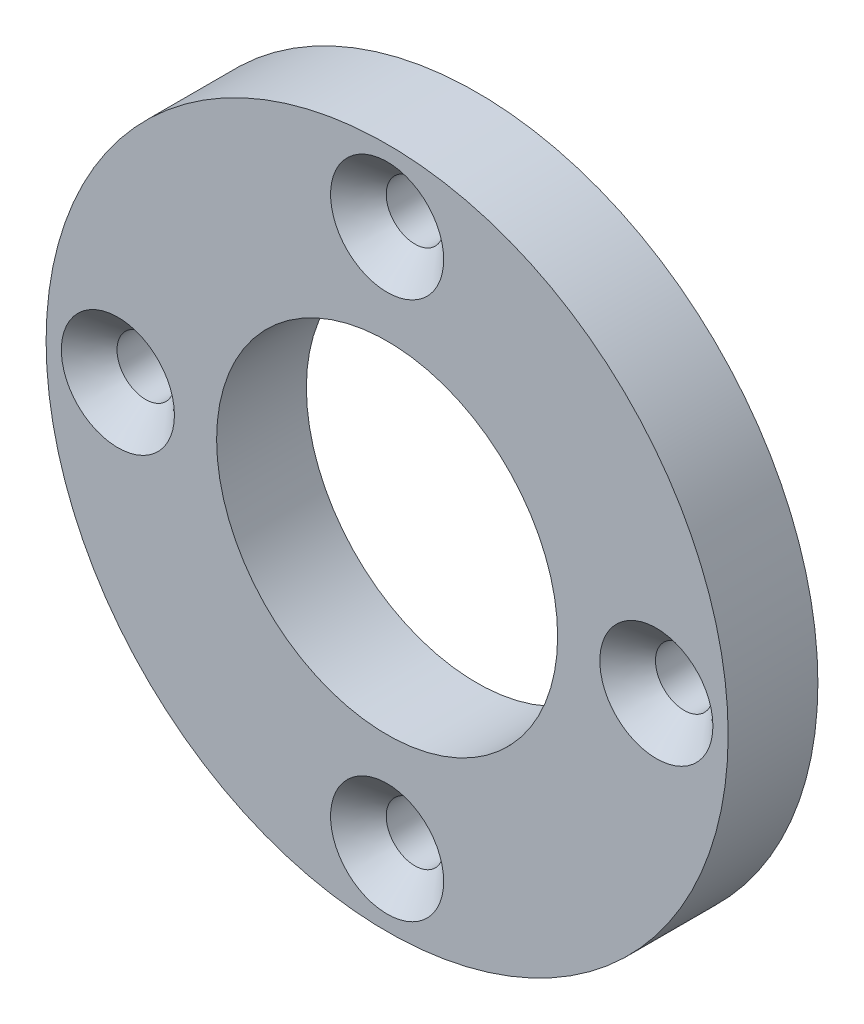
ISO-10303-21;
HEADER;
FILE_DESCRIPTION(('STEP AP214'),'2;1');
FILE_NAME('part.step','',(''),(''),'','','');
FILE_SCHEMA(('AUTOMOTIVE_DESIGN { 1 0 10303 214 1 1 1 1 }'));
ENDSEC;
DATA;
#1=APPLICATION_CONTEXT('core data for automotive mechanical design processes');
#2=APPLICATION_PROTOCOL_DEFINITION('international standard','automotive_design',2000,#1);
#3=PRODUCT_CONTEXT('',#1,'mechanical');
#4=PRODUCT('Part','Part','',(#3));
#5=PRODUCT_RELATED_PRODUCT_CATEGORY('part','',(#4));
#6=PRODUCT_DEFINITION_FORMATION('','',#4);
#7=PRODUCT_DEFINITION_CONTEXT('part definition',#1,'design');
#8=PRODUCT_DEFINITION('design','',#6,#7);
#9=PRODUCT_DEFINITION_SHAPE('','',#8);
#10=(LENGTH_UNIT() NAMED_UNIT(*) SI_UNIT(.MILLI.,.METRE.));
#11=(NAMED_UNIT(*) PLANE_ANGLE_UNIT() SI_UNIT($,.RADIAN.));
#12=(NAMED_UNIT(*) SI_UNIT($,.STERADIAN.) SOLID_ANGLE_UNIT());
#13=UNCERTAINTY_MEASURE_WITH_UNIT(LENGTH_MEASURE(1.E-05),#10,'distance_accuracy_value','');
#14=(GEOMETRIC_REPRESENTATION_CONTEXT(3) GLOBAL_UNCERTAINTY_ASSIGNED_CONTEXT((#13)) GLOBAL_UNIT_ASSIGNED_CONTEXT((#10,
#11,#12)) REPRESENTATION_CONTEXT('',''));
#15=CARTESIAN_POINT('',(0.,0.,0.));
#16=DIRECTION('',(0.,0.,1.));
#17=DIRECTION('',(1.,0.,0.));
#18=AXIS2_PLACEMENT_3D('',#15,#16,#17);
#19=CARTESIAN_POINT('',(0.,0.,5.));
#20=DIRECTION('',(0.,0.,1.));
#21=DIRECTION('',(1.,0.,0.));
#22=AXIS2_PLACEMENT_3D('',#19,#20,#21);
#23=PLANE('',#22);
#24=CARTESIAN_POINT('',(0.,15.,5.));
#25=DIRECTION('',(0.,0.,1.));
#26=DIRECTION('',(1.,0.,0.));
#27=AXIS2_PLACEMENT_3D('',#24,#25,#26);
#28=CIRCLE('',#27,3.15);
#29=CARTESIAN_POINT('',(3.15,15.,5.));
#30=VERTEX_POINT('',#29);
#31=EDGE_CURVE('E83',#30,#30,#28,.T.);
#32=ORIENTED_EDGE('',*,*,#31,.F.);
#33=EDGE_LOOP('',(#32));
#34=FACE_BOUND('',#33,.T.);
#35=CARTESIAN_POINT('',(15.,0.,5.));
#36=DIRECTION('',(0.,0.,1.));
#37=DIRECTION('',(1.,0.,0.));
#38=AXIS2_PLACEMENT_3D('',#35,#36,#37);
#39=CIRCLE('',#38,3.15);
#40=CARTESIAN_POINT('',(18.15,0.,5.));
#41=VERTEX_POINT('',#40);
#42=EDGE_CURVE('E74',#41,#41,#39,.T.);
#43=ORIENTED_EDGE('',*,*,#42,.F.);
#44=EDGE_LOOP('',(#43));
#45=FACE_BOUND('',#44,.T.);
#46=CARTESIAN_POINT('',(0.,-15.,5.));
#47=DIRECTION('',(0.,0.,1.));
#48=DIRECTION('',(1.,0.,0.));
#49=AXIS2_PLACEMENT_3D('',#46,#47,#48);
#50=CIRCLE('',#49,3.15);
#51=CARTESIAN_POINT('',(3.15,-15.,5.));
#52=VERTEX_POINT('',#51);
#53=EDGE_CURVE('E65',#52,#52,#50,.T.);
#54=ORIENTED_EDGE('',*,*,#53,.F.);
#55=EDGE_LOOP('',(#54));
#56=FACE_BOUND('',#55,.T.);
#57=CARTESIAN_POINT('',(-15.,0.,5.));
#58=DIRECTION('',(0.,0.,1.));
#59=DIRECTION('',(1.,0.,0.));
#60=AXIS2_PLACEMENT_3D('',#57,#58,#59);
#61=CIRCLE('',#60,3.15);
#62=CARTESIAN_POINT('',(-11.85,0.,5.));
#63=VERTEX_POINT('',#62);
#64=EDGE_CURVE('E56',#63,#63,#61,.T.);
#65=ORIENTED_EDGE('',*,*,#64,.F.);
#66=EDGE_LOOP('',(#65));
#67=FACE_BOUND('',#66,.T.);
#68=CARTESIAN_POINT('',(0.,0.,5.));
#69=DIRECTION('',(0.,0.,1.));
#70=DIRECTION('',(1.,0.,0.));
#71=AXIS2_PLACEMENT_3D('',#68,#69,#70);
#72=CIRCLE('',#71,19.);
#73=CARTESIAN_POINT('',(19.,0.,5.));
#74=VERTEX_POINT('',#73);
#75=EDGE_CURVE('E10',#74,#74,#72,.T.);
#76=ORIENTED_EDGE('',*,*,#75,.T.);
#77=EDGE_LOOP('',(#76));
#78=FACE_BOUND('',#77,.T.);
#79=CARTESIAN_POINT('',(0.,0.,5.));
#80=DIRECTION('',(0.,0.,1.));
#81=DIRECTION('',(1.,0.,0.));
#82=AXIS2_PLACEMENT_3D('',#79,#80,#81);
#83=CIRCLE('',#82,9.5);
#84=CARTESIAN_POINT('',(9.5,0.,5.));
#85=VERTEX_POINT('',#84);
#86=EDGE_CURVE('E43',#85,#85,#83,.T.);
#87=ORIENTED_EDGE('',*,*,#86,.F.);
#88=EDGE_LOOP('',(#87));
#89=FACE_BOUND('',#88,.T.);
#90=ADVANCED_FACE('F32',(#34,#45,#56,#67,#78,#89),#23,.T.);
#91=CARTESIAN_POINT('',(0.,0.,0.));
#92=DIRECTION('',(0.,0.,1.));
#93=DIRECTION('',(1.,0.,0.));
#94=AXIS2_PLACEMENT_3D('',#91,#92,#93);
#95=PLANE('',#94);
#96=CARTESIAN_POINT('',(0.,15.,0.));
#97=DIRECTION('',(0.,0.,1.));
#98=DIRECTION('',(1.,0.,0.));
#99=AXIS2_PLACEMENT_3D('',#96,#97,#98);
#100=CIRCLE('',#99,1.6);
#101=CARTESIAN_POINT('',(1.6,15.,0.));
#102=VERTEX_POINT('',#101);
#103=EDGE_CURVE('E77',#102,#102,#100,.T.);
#104=ORIENTED_EDGE('',*,*,#103,.T.);
#105=EDGE_LOOP('',(#104));
#106=FACE_BOUND('',#105,.T.);
#107=CARTESIAN_POINT('',(15.,0.,0.));
#108=DIRECTION('',(0.,0.,1.));
#109=DIRECTION('',(1.,0.,0.));
#110=AXIS2_PLACEMENT_3D('',#107,#108,#109);
#111=CIRCLE('',#110,1.6);
#112=CARTESIAN_POINT('',(16.6,0.,0.));
#113=VERTEX_POINT('',#112);
#114=EDGE_CURVE('E68',#113,#113,#111,.T.);
#115=ORIENTED_EDGE('',*,*,#114,.T.);
#116=EDGE_LOOP('',(#115));
#117=FACE_BOUND('',#116,.T.);
#118=CARTESIAN_POINT('',(0.,-15.,0.));
#119=DIRECTION('',(0.,0.,1.));
#120=DIRECTION('',(1.,0.,0.));
#121=AXIS2_PLACEMENT_3D('',#118,#119,#120);
#122=CIRCLE('',#121,1.6);
#123=CARTESIAN_POINT('',(1.6,-15.,0.));
#124=VERTEX_POINT('',#123);
#125=EDGE_CURVE('E59',#124,#124,#122,.T.);
#126=ORIENTED_EDGE('',*,*,#125,.T.);
#127=EDGE_LOOP('',(#126));
#128=FACE_BOUND('',#127,.T.);
#129=CARTESIAN_POINT('',(-15.,0.,0.));
#130=DIRECTION('',(0.,0.,1.));
#131=DIRECTION('',(1.,0.,0.));
#132=AXIS2_PLACEMENT_3D('',#129,#130,#131);
#133=CIRCLE('',#132,1.6);
#134=CARTESIAN_POINT('',(-13.4,0.,0.));
#135=VERTEX_POINT('',#134);
#136=EDGE_CURVE('E48',#135,#135,#133,.T.);
#137=ORIENTED_EDGE('',*,*,#136,.T.);
#138=EDGE_LOOP('',(#137));
#139=FACE_BOUND('',#138,.T.);
#140=CARTESIAN_POINT('',(0.,0.,0.));
#141=DIRECTION('',(0.,0.,1.));
#142=DIRECTION('',(1.,0.,0.));
#143=AXIS2_PLACEMENT_3D('',#140,#141,#142);
#144=CIRCLE('',#143,19.);
#145=CARTESIAN_POINT('',(19.,0.,0.));
#146=VERTEX_POINT('',#145);
#147=EDGE_CURVE('E36',#146,#146,#144,.T.);
#148=ORIENTED_EDGE('',*,*,#147,.F.);
#149=EDGE_LOOP('',(#148));
#150=FACE_BOUND('',#149,.T.);
#151=CARTESIAN_POINT('',(0.,0.,0.));
#152=DIRECTION('',(0.,0.,1.));
#153=DIRECTION('',(1.,0.,0.));
#154=AXIS2_PLACEMENT_3D('',#151,#152,#153);
#155=CIRCLE('',#154,9.5);
#156=CARTESIAN_POINT('',(9.5,0.,0.));
#157=VERTEX_POINT('',#156);
#158=EDGE_CURVE('E45',#157,#157,#155,.T.);
#159=ORIENTED_EDGE('',*,*,#158,.T.);
#160=EDGE_LOOP('',(#159));
#161=FACE_BOUND('',#160,.T.);
#162=ADVANCED_FACE('F91',(#106,#117,#128,#139,#150,#161),#95,.F.);
#163=CARTESIAN_POINT('',(0.,0.,5.));
#164=DIRECTION('',(0.,0.,-1.));
#165=DIRECTION('',(-1.,0.,0.));
#166=AXIS2_PLACEMENT_3D('',#163,#164,#165);
#167=CYLINDRICAL_SURFACE('',#166,19.);
#168=ORIENTED_EDGE('',*,*,#75,.F.);
#169=EDGE_LOOP('',(#168));
#170=FACE_BOUND('',#169,.T.);
#171=ORIENTED_EDGE('',*,*,#147,.T.);
#172=EDGE_LOOP('',(#171));
#173=FACE_BOUND('',#172,.T.);
#174=ADVANCED_FACE('F34',(#170,#173),#167,.T.);
#175=CARTESIAN_POINT('',(0.,0.,5.));
#176=DIRECTION('',(0.,0.,-1.));
#177=DIRECTION('',(-1.,0.,0.));
#178=AXIS2_PLACEMENT_3D('',#175,#176,#177);
#179=CYLINDRICAL_SURFACE('',#178,9.5);
#180=ORIENTED_EDGE('',*,*,#86,.T.);
#181=EDGE_LOOP('',(#180));
#182=FACE_BOUND('',#181,.T.);
#183=ORIENTED_EDGE('',*,*,#158,.F.);
#184=EDGE_LOOP('',(#183));
#185=FACE_BOUND('',#184,.T.);
#186=ADVANCED_FACE('F101',(#182,#185),#179,.F.);
#187=CARTESIAN_POINT('',(-15.,0.,5.));
#188=DIRECTION('',(0.,0.,1.));
#189=DIRECTION('',(1.,0.,0.));
#190=AXIS2_PLACEMENT_3D('',#187,#188,#189);
#191=CYLINDRICAL_SURFACE('',#190,1.59999999999999);
#192=ORIENTED_EDGE('',*,*,#136,.F.);
#193=EDGE_LOOP('',(#192));
#194=FACE_BOUND('',#193,.T.);
#195=CARTESIAN_POINT('',(-15.,0.,3.45));
#196=DIRECTION('',(0.,0.,1.));
#197=DIRECTION('',(1.,0.,0.));
#198=AXIS2_PLACEMENT_3D('',#195,#196,#197);
#199=CIRCLE('',#198,1.59999999999999);
#200=CARTESIAN_POINT('',(-13.4,0.,3.45));
#201=VERTEX_POINT('',#200);
#202=EDGE_CURVE('E53',#201,#201,#199,.T.);
#203=ORIENTED_EDGE('',*,*,#202,.T.);
#204=EDGE_LOOP('',(#203));
#205=FACE_BOUND('',#204,.T.);
#206=ADVANCED_FACE('F104',(#194,#205),#191,.F.);
#207=CARTESIAN_POINT('',(-15.,0.,5.));
#208=DIRECTION('',(0.,0.,1.));
#209=DIRECTION('',(1.,0.,0.));
#210=AXIS2_PLACEMENT_3D('',#207,#208,#209);
#211=CONICAL_SURFACE('',#210,3.15,0.785398163397453);
#212=ORIENTED_EDGE('',*,*,#202,.F.);
#213=EDGE_LOOP('',(#212));
#214=FACE_BOUND('',#213,.T.);
#215=ORIENTED_EDGE('',*,*,#64,.T.);
#216=EDGE_LOOP('',(#215));
#217=FACE_BOUND('',#216,.T.);
#218=ADVANCED_FACE('F118',(#214,#217),#211,.F.);
#219=CARTESIAN_POINT('',(0.,-15.,5.));
#220=DIRECTION('',(0.,0.,1.));
#221=DIRECTION('',(1.,0.,0.));
#222=AXIS2_PLACEMENT_3D('',#219,#220,#221);
#223=CYLINDRICAL_SURFACE('',#222,1.59999999999999);
#224=ORIENTED_EDGE('',*,*,#125,.F.);
#225=EDGE_LOOP('',(#224));
#226=FACE_BOUND('',#225,.T.);
#227=CARTESIAN_POINT('',(0.,-15.,3.45));
#228=DIRECTION('',(0.,0.,1.));
#229=DIRECTION('',(1.,0.,0.));
#230=AXIS2_PLACEMENT_3D('',#227,#228,#229);
#231=CIRCLE('',#230,1.59999999999999);
#232=CARTESIAN_POINT('',(1.59999999999999,-15.,3.45));
#233=VERTEX_POINT('',#232);
#234=EDGE_CURVE('E62',#233,#233,#231,.T.);
#235=ORIENTED_EDGE('',*,*,#234,.T.);
#236=EDGE_LOOP('',(#235));
#237=FACE_BOUND('',#236,.T.);
#238=ADVANCED_FACE('F122',(#226,#237),#223,.F.);
#239=CARTESIAN_POINT('',(0.,-15.,5.));
#240=DIRECTION('',(0.,0.,1.));
#241=DIRECTION('',(1.,0.,0.));
#242=AXIS2_PLACEMENT_3D('',#239,#240,#241);
#243=CONICAL_SURFACE('',#242,3.15,0.785398163397453);
#244=ORIENTED_EDGE('',*,*,#234,.F.);
#245=EDGE_LOOP('',(#244));
#246=FACE_BOUND('',#245,.T.);
#247=ORIENTED_EDGE('',*,*,#53,.T.);
#248=EDGE_LOOP('',(#247));
#249=FACE_BOUND('',#248,.T.);
#250=ADVANCED_FACE('F126',(#246,#249),#243,.F.);
#251=CARTESIAN_POINT('',(15.,0.,5.));
#252=DIRECTION('',(0.,0.,1.));
#253=DIRECTION('',(1.,0.,0.));
#254=AXIS2_PLACEMENT_3D('',#251,#252,#253);
#255=CYLINDRICAL_SURFACE('',#254,1.59999999999999);
#256=ORIENTED_EDGE('',*,*,#114,.F.);
#257=EDGE_LOOP('',(#256));
#258=FACE_BOUND('',#257,.T.);
#259=CARTESIAN_POINT('',(15.,0.,3.45));
#260=DIRECTION('',(0.,0.,1.));
#261=DIRECTION('',(1.,0.,0.));
#262=AXIS2_PLACEMENT_3D('',#259,#260,#261);
#263=CIRCLE('',#262,1.59999999999999);
#264=CARTESIAN_POINT('',(16.6,0.,3.45));
#265=VERTEX_POINT('',#264);
#266=EDGE_CURVE('E71',#265,#265,#263,.T.);
#267=ORIENTED_EDGE('',*,*,#266,.T.);
#268=EDGE_LOOP('',(#267));
#269=FACE_BOUND('',#268,.T.);
#270=ADVANCED_FACE('F130',(#258,#269),#255,.F.);
#271=CARTESIAN_POINT('',(15.,0.,5.));
#272=DIRECTION('',(0.,0.,1.));
#273=DIRECTION('',(1.,0.,0.));
#274=AXIS2_PLACEMENT_3D('',#271,#272,#273);
#275=CONICAL_SURFACE('',#274,3.15,0.785398163397453);
#276=ORIENTED_EDGE('',*,*,#266,.F.);
#277=EDGE_LOOP('',(#276));
#278=FACE_BOUND('',#277,.T.);
#279=ORIENTED_EDGE('',*,*,#42,.T.);
#280=EDGE_LOOP('',(#279));
#281=FACE_BOUND('',#280,.T.);
#282=ADVANCED_FACE('F134',(#278,#281),#275,.F.);
#283=CARTESIAN_POINT('',(0.,15.,5.));
#284=DIRECTION('',(0.,0.,1.));
#285=DIRECTION('',(1.,0.,0.));
#286=AXIS2_PLACEMENT_3D('',#283,#284,#285);
#287=CYLINDRICAL_SURFACE('',#286,1.59999999999999);
#288=ORIENTED_EDGE('',*,*,#103,.F.);
#289=EDGE_LOOP('',(#288));
#290=FACE_BOUND('',#289,.T.);
#291=CARTESIAN_POINT('',(0.,15.,3.45));
#292=DIRECTION('',(0.,0.,1.));
#293=DIRECTION('',(1.,0.,0.));
#294=AXIS2_PLACEMENT_3D('',#291,#292,#293);
#295=CIRCLE('',#294,1.59999999999999);
#296=CARTESIAN_POINT('',(1.59999999999999,15.,3.45));
#297=VERTEX_POINT('',#296);
#298=EDGE_CURVE('E80',#297,#297,#295,.T.);
#299=ORIENTED_EDGE('',*,*,#298,.T.);
#300=EDGE_LOOP('',(#299));
#301=FACE_BOUND('',#300,.T.);
#302=ADVANCED_FACE('F138',(#290,#301),#287,.F.);
#303=CARTESIAN_POINT('',(0.,15.,5.));
#304=DIRECTION('',(0.,0.,1.));
#305=DIRECTION('',(1.,0.,0.));
#306=AXIS2_PLACEMENT_3D('',#303,#304,#305);
#307=CONICAL_SURFACE('',#306,3.15,0.785398163397453);
#308=ORIENTED_EDGE('',*,*,#298,.F.);
#309=EDGE_LOOP('',(#308));
#310=FACE_BOUND('',#309,.T.);
#311=ORIENTED_EDGE('',*,*,#31,.T.);
#312=EDGE_LOOP('',(#311));
#313=FACE_BOUND('',#312,.T.);
#314=ADVANCED_FACE('F87',(#310,#313),#307,.F.);
#315=CLOSED_SHELL('',(#90,#162,#174,#186,#206,#218,#238,#250,#270,#282,#302,#314));
#316=MANIFOLD_SOLID_BREP('B2',#315);
#317=ADVANCED_BREP_SHAPE_REPRESENTATION('',(#18,#316),#14);
#318=SHAPE_DEFINITION_REPRESENTATION(#9,#317);
ENDSEC;
END-ISO-10303-21;
